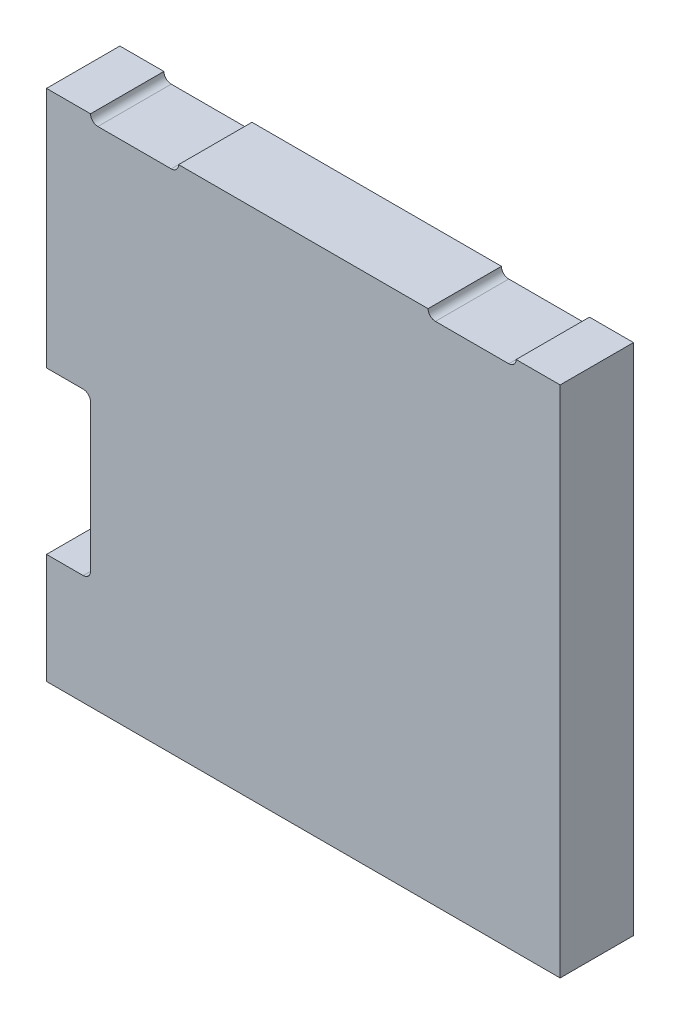
ISO-10303-21;
HEADER;
FILE_DESCRIPTION(('STEP AP214'),'2;1');
FILE_NAME('part.step','',(''),(''),'','','');
FILE_SCHEMA(('AUTOMOTIVE_DESIGN { 1 0 10303 214 1 1 1 1 }'));
ENDSEC;
DATA;
#1=APPLICATION_CONTEXT('core data for automotive mechanical design processes');
#2=APPLICATION_PROTOCOL_DEFINITION('international standard','automotive_design',2000,#1);
#3=PRODUCT_CONTEXT('',#1,'mechanical');
#4=PRODUCT('Part','Part','',(#3));
#5=PRODUCT_RELATED_PRODUCT_CATEGORY('part','',(#4));
#6=PRODUCT_DEFINITION_FORMATION('','',#4);
#7=PRODUCT_DEFINITION_CONTEXT('part definition',#1,'design');
#8=PRODUCT_DEFINITION('design','',#6,#7);
#9=PRODUCT_DEFINITION_SHAPE('','',#8);
#10=(LENGTH_UNIT() NAMED_UNIT(*) SI_UNIT(.MILLI.,.METRE.));
#11=(NAMED_UNIT(*) PLANE_ANGLE_UNIT() SI_UNIT($,.RADIAN.));
#12=(NAMED_UNIT(*) SI_UNIT($,.STERADIAN.) SOLID_ANGLE_UNIT());
#13=UNCERTAINTY_MEASURE_WITH_UNIT(LENGTH_MEASURE(1.E-05),#10,'distance_accuracy_value','');
#14=(GEOMETRIC_REPRESENTATION_CONTEXT(3) GLOBAL_UNCERTAINTY_ASSIGNED_CONTEXT((#13)) GLOBAL_UNIT_ASSIGNED_CONTEXT((#10,
#11,#12)) REPRESENTATION_CONTEXT('',''));
#15=CARTESIAN_POINT('',(0.,0.,0.));
#16=DIRECTION('',(0.,0.,1.));
#17=DIRECTION('',(1.,0.,0.));
#18=AXIS2_PLACEMENT_3D('',#15,#16,#17);
#19=CARTESIAN_POINT('',(0.,35.,10.));
#20=DIRECTION('',(0.,1.,0.));
#21=DIRECTION('',(0.,0.,1.));
#22=AXIS2_PLACEMENT_3D('',#19,#20,#21);
#23=PLANE('',#22);
#24=DIRECTION('',(1.,0.,0.));
#25=VECTOR('',#24,1.);
#26=CARTESIAN_POINT('',(0.,35.,0.));
#27=LINE('',#26,#25);
#28=CARTESIAN_POINT('',(29.,35.,0.));
#29=VERTEX_POINT('',#28);
#30=CARTESIAN_POINT('',(35.,35.,0.));
#31=VERTEX_POINT('',#30);
#32=EDGE_CURVE('E174',#29,#31,#27,.T.);
#33=ORIENTED_EDGE('',*,*,#32,.F.);
#34=DIRECTION('',(0.,0.,-1.));
#35=VECTOR('',#34,1.);
#36=CARTESIAN_POINT('',(29.,35.,10.));
#37=LINE('',#36,#35);
#38=CARTESIAN_POINT('',(29.,35.,10.));
#39=VERTEX_POINT('',#38);
#40=EDGE_CURVE('E169',#39,#29,#37,.T.);
#41=ORIENTED_EDGE('',*,*,#40,.F.);
#42=DIRECTION('',(1.,0.,0.));
#43=VECTOR('',#42,1.);
#44=CARTESIAN_POINT('',(0.,35.,10.));
#45=LINE('',#44,#43);
#46=CARTESIAN_POINT('',(35.,35.,10.));
#47=VERTEX_POINT('',#46);
#48=EDGE_CURVE('E171',#39,#47,#45,.T.);
#49=ORIENTED_EDGE('',*,*,#48,.T.);
#50=DIRECTION('',(0.,0.,-1.));
#51=VECTOR('',#50,1.);
#52=CARTESIAN_POINT('',(35.,35.,10.));
#53=LINE('',#52,#51);
#54=EDGE_CURVE('E331',#47,#31,#53,.T.);
#55=ORIENTED_EDGE('',*,*,#54,.T.);
#56=EDGE_LOOP('',(#33,#41,#49,#55));
#57=FACE_BOUND('',#56,.T.);
#58=ADVANCED_FACE('F41',(#57),#23,.T.);
#59=CARTESIAN_POINT('',(0.,34.,10.));
#60=DIRECTION('',(0.,1.,0.));
#61=DIRECTION('',(0.,0.,1.));
#62=AXIS2_PLACEMENT_3D('',#59,#60,#61);
#63=PLANE('',#62);
#64=DIRECTION('',(1.,0.,0.));
#65=VECTOR('',#64,1.);
#66=CARTESIAN_POINT('',(0.,34.,10.));
#67=LINE('',#66,#65);
#68=CARTESIAN_POINT('',(18.,34.,10.));
#69=VERTEX_POINT('',#68);
#70=CARTESIAN_POINT('',(28.,34.,10.));
#71=VERTEX_POINT('',#70);
#72=EDGE_CURVE('E188',#69,#71,#67,.T.);
#73=ORIENTED_EDGE('',*,*,#72,.T.);
#74=DIRECTION('',(0.,0.,-1.));
#75=VECTOR('',#74,1.);
#76=CARTESIAN_POINT('',(28.,34.,10.));
#77=LINE('',#76,#75);
#78=CARTESIAN_POINT('',(28.,34.,0.));
#79=VERTEX_POINT('',#78);
#80=EDGE_CURVE('E196',#71,#79,#77,.T.);
#81=ORIENTED_EDGE('',*,*,#80,.T.);
#82=DIRECTION('',(1.,0.,0.));
#83=VECTOR('',#82,1.);
#84=CARTESIAN_POINT('',(0.,34.,0.));
#85=LINE('',#84,#83);
#86=CARTESIAN_POINT('',(18.,34.,0.));
#87=VERTEX_POINT('',#86);
#88=EDGE_CURVE('E292',#87,#79,#85,.T.);
#89=ORIENTED_EDGE('',*,*,#88,.F.);
#90=DIRECTION('',(0.,0.,-1.));
#91=VECTOR('',#90,1.);
#92=CARTESIAN_POINT('',(18.,34.,10.));
#93=LINE('',#92,#91);
#94=EDGE_CURVE('E241',#87,#69,#93,.F.);
#95=ORIENTED_EDGE('',*,*,#94,.T.);
#96=EDGE_LOOP('',(#73,#81,#89,#95));
#97=FACE_BOUND('',#96,.T.);
#98=ADVANCED_FACE('F290',(#97),#63,.T.);
#99=CARTESIAN_POINT('',(-17.,35.,0.));
#100=VERTEX_POINT('',#99);
#101=CARTESIAN_POINT('',(17.,35.,0.));
#102=VERTEX_POINT('',#101);
#103=EDGE_CURVE('E232',#100,#102,#27,.T.);
#104=ORIENTED_EDGE('',*,*,#103,.F.);
#105=DIRECTION('',(0.,0.,-1.));
#106=VECTOR('',#105,1.);
#107=CARTESIAN_POINT('',(-17.,35.,10.));
#108=LINE('',#107,#106);
#109=CARTESIAN_POINT('',(-17.,35.,10.));
#110=VERTEX_POINT('',#109);
#111=EDGE_CURVE('E305',#110,#100,#108,.T.);
#112=ORIENTED_EDGE('',*,*,#111,.F.);
#113=CARTESIAN_POINT('',(17.,35.,10.));
#114=VERTEX_POINT('',#113);
#115=EDGE_CURVE('E192',#110,#114,#45,.T.);
#116=ORIENTED_EDGE('',*,*,#115,.T.);
#117=DIRECTION('',(0.,0.,-1.));
#118=VECTOR('',#117,1.);
#119=CARTESIAN_POINT('',(17.,35.,10.));
#120=LINE('',#119,#118);
#121=EDGE_CURVE('E179',#114,#102,#120,.T.);
#122=ORIENTED_EDGE('',*,*,#121,.T.);
#123=EDGE_LOOP('',(#104,#112,#116,#122));
#124=FACE_BOUND('',#123,.T.);
#125=ADVANCED_FACE('F379',(#124),#23,.T.);
#126=CARTESIAN_POINT('',(0.,34.,10.));
#127=DIRECTION('',(0.,1.,0.));
#128=DIRECTION('',(0.,0.,1.));
#129=AXIS2_PLACEMENT_3D('',#126,#127,#128);
#130=PLANE('',#129);
#131=DIRECTION('',(1.,0.,0.));
#132=VECTOR('',#131,1.);
#133=CARTESIAN_POINT('',(0.,34.,10.));
#134=LINE('',#133,#132);
#135=CARTESIAN_POINT('',(-28.,34.,10.));
#136=VERTEX_POINT('',#135);
#137=CARTESIAN_POINT('',(-18.,34.,10.));
#138=VERTEX_POINT('',#137);
#139=EDGE_CURVE('E374',#136,#138,#134,.T.);
#140=ORIENTED_EDGE('',*,*,#139,.T.);
#141=DIRECTION('',(0.,0.,-1.));
#142=VECTOR('',#141,1.);
#143=CARTESIAN_POINT('',(-18.,34.,10.));
#144=LINE('',#143,#142);
#145=CARTESIAN_POINT('',(-18.,34.,0.));
#146=VERTEX_POINT('',#145);
#147=EDGE_CURVE('E230',#138,#146,#144,.T.);
#148=ORIENTED_EDGE('',*,*,#147,.T.);
#149=DIRECTION('',(1.,0.,0.));
#150=VECTOR('',#149,1.);
#151=CARTESIAN_POINT('',(0.,34.,0.));
#152=LINE('',#151,#150);
#153=CARTESIAN_POINT('',(-28.,34.,0.));
#154=VERTEX_POINT('',#153);
#155=EDGE_CURVE('E220',#154,#146,#152,.T.);
#156=ORIENTED_EDGE('',*,*,#155,.F.);
#157=DIRECTION('',(0.,0.,-1.));
#158=VECTOR('',#157,1.);
#159=CARTESIAN_POINT('',(-28.,34.,10.));
#160=LINE('',#159,#158);
#161=EDGE_CURVE('E64',#154,#136,#160,.F.);
#162=ORIENTED_EDGE('',*,*,#161,.T.);
#163=EDGE_LOOP('',(#140,#148,#156,#162));
#164=FACE_BOUND('',#163,.T.);
#165=ADVANCED_FACE('F228',(#164),#130,.T.);
#166=CARTESIAN_POINT('',(-35.,35.,0.));
#167=VERTEX_POINT('',#166);
#168=CARTESIAN_POINT('',(-29.,35.,0.));
#169=VERTEX_POINT('',#168);
#170=EDGE_CURVE('E223',#167,#169,#27,.T.);
#171=ORIENTED_EDGE('',*,*,#170,.F.);
#172=DIRECTION('',(0.,0.,-1.));
#173=VECTOR('',#172,1.);
#174=CARTESIAN_POINT('',(-35.,35.,10.));
#175=LINE('',#174,#173);
#176=CARTESIAN_POINT('',(-35.,35.,10.));
#177=VERTEX_POINT('',#176);
#178=EDGE_CURVE('E314',#177,#167,#175,.T.);
#179=ORIENTED_EDGE('',*,*,#178,.F.);
#180=CARTESIAN_POINT('',(-29.,35.,10.));
#181=VERTEX_POINT('',#180);
#182=EDGE_CURVE('E191',#177,#181,#45,.T.);
#183=ORIENTED_EDGE('',*,*,#182,.T.);
#184=DIRECTION('',(0.,0.,-1.));
#185=VECTOR('',#184,1.);
#186=CARTESIAN_POINT('',(-29.,35.,10.));
#187=LINE('',#186,#185);
#188=EDGE_CURVE('E309',#181,#169,#187,.T.);
#189=ORIENTED_EDGE('',*,*,#188,.T.);
#190=EDGE_LOOP('',(#171,#179,#183,#189));
#191=FACE_BOUND('',#190,.T.);
#192=ADVANCED_FACE('F410',(#191),#23,.T.);
#193=CARTESIAN_POINT('',(-35.,0.,10.));
#194=DIRECTION('',(1.,0.,0.));
#195=DIRECTION('',(0.,0.,-1.));
#196=AXIS2_PLACEMENT_3D('',#193,#194,#195);
#197=PLANE('',#196);
#198=DIRECTION('',(0.,-1.,0.));
#199=VECTOR('',#198,1.);
#200=CARTESIAN_POINT('',(-35.,0.,0.));
#201=LINE('',#200,#199);
#202=CARTESIAN_POINT('',(-35.,1.99999999999999,0.));
#203=VERTEX_POINT('',#202);
#204=EDGE_CURVE('E353',#167,#203,#201,.T.);
#205=ORIENTED_EDGE('',*,*,#204,.T.);
#206=DIRECTION('',(0.,0.,-1.));
#207=VECTOR('',#206,1.);
#208=CARTESIAN_POINT('',(-35.,1.99999999999999,10.));
#209=LINE('',#208,#207);
#210=CARTESIAN_POINT('',(-35.,1.99999999999999,10.));
#211=VERTEX_POINT('',#210);
#212=EDGE_CURVE('E317',#211,#203,#209,.T.);
#213=ORIENTED_EDGE('',*,*,#212,.F.);
#214=DIRECTION('',(0.,-1.,0.));
#215=VECTOR('',#214,1.);
#216=CARTESIAN_POINT('',(-35.,0.,10.));
#217=LINE('',#216,#215);
#218=EDGE_CURVE('E371',#177,#211,#217,.T.);
#219=ORIENTED_EDGE('',*,*,#218,.F.);
#220=ORIENTED_EDGE('',*,*,#178,.T.);
#221=EDGE_LOOP('',(#205,#213,#219,#220));
#222=FACE_BOUND('',#221,.T.);
#223=ADVANCED_FACE('F419',(#222),#197,.F.);
#224=CARTESIAN_POINT('',(0.,1.99999999999999,10.));
#225=DIRECTION('',(0.,1.,0.));
#226=DIRECTION('',(0.,0.,1.));
#227=AXIS2_PLACEMENT_3D('',#224,#225,#226);
#228=PLANE('',#227);
#229=DIRECTION('',(1.,0.,0.));
#230=VECTOR('',#229,1.);
#231=CARTESIAN_POINT('',(0.,1.99999999999999,0.));
#232=LINE('',#231,#230);
#233=CARTESIAN_POINT('',(-30.,1.99999999999999,0.));
#234=VERTEX_POINT('',#233);
#235=EDGE_CURVE('E349',#203,#234,#232,.T.);
#236=ORIENTED_EDGE('',*,*,#235,.T.);
#237=DIRECTION('',(0.,0.,-1.));
#238=VECTOR('',#237,1.);
#239=CARTESIAN_POINT('',(-30.,1.99999999999999,10.));
#240=LINE('',#239,#238);
#241=CARTESIAN_POINT('',(-30.,1.99999999999999,10.));
#242=VERTEX_POINT('',#241);
#243=EDGE_CURVE('E280',#234,#242,#240,.F.);
#244=ORIENTED_EDGE('',*,*,#243,.T.);
#245=DIRECTION('',(1.,0.,0.));
#246=VECTOR('',#245,1.);
#247=CARTESIAN_POINT('',(0.,1.99999999999999,10.));
#248=LINE('',#247,#246);
#249=EDGE_CURVE('E260',#211,#242,#248,.T.);
#250=ORIENTED_EDGE('',*,*,#249,.F.);
#251=ORIENTED_EDGE('',*,*,#212,.T.);
#252=EDGE_LOOP('',(#236,#244,#250,#251));
#253=FACE_BOUND('',#252,.T.);
#254=ADVANCED_FACE('F425',(#253),#228,.F.);
#255=CARTESIAN_POINT('',(-29.,0.,10.));
#256=DIRECTION('',(1.,0.,0.));
#257=DIRECTION('',(0.,0.,-1.));
#258=AXIS2_PLACEMENT_3D('',#255,#256,#257);
#259=PLANE('',#258);
#260=DIRECTION('',(0.,-1.,0.));
#261=VECTOR('',#260,1.);
#262=CARTESIAN_POINT('',(-29.,0.,0.));
#263=LINE('',#262,#261);
#264=CARTESIAN_POINT('',(-29.,0.999999999999995,0.));
#265=VERTEX_POINT('',#264);
#266=CARTESIAN_POINT('',(-29.,-19.,0.));
#267=VERTEX_POINT('',#266);
#268=EDGE_CURVE('E346',#265,#267,#263,.T.);
#269=ORIENTED_EDGE('',*,*,#268,.T.);
#270=DIRECTION('',(0.,0.,-1.));
#271=VECTOR('',#270,1.);
#272=CARTESIAN_POINT('',(-29.,-19.,10.));
#273=LINE('',#272,#271);
#274=CARTESIAN_POINT('',(-29.,-19.,10.));
#275=VERTEX_POINT('',#274);
#276=EDGE_CURVE('E271',#267,#275,#273,.F.);
#277=ORIENTED_EDGE('',*,*,#276,.T.);
#278=DIRECTION('',(0.,-1.,0.));
#279=VECTOR('',#278,1.);
#280=CARTESIAN_POINT('',(-29.,0.,10.));
#281=LINE('',#280,#279);
#282=CARTESIAN_POINT('',(-29.,0.999999999999995,10.));
#283=VERTEX_POINT('',#282);
#284=EDGE_CURVE('E257',#283,#275,#281,.T.);
#285=ORIENTED_EDGE('',*,*,#284,.F.);
#286=DIRECTION('',(0.,0.,-1.));
#287=VECTOR('',#286,1.);
#288=CARTESIAN_POINT('',(-29.,0.999999999999995,0.));
#289=LINE('',#288,#287);
#290=EDGE_CURVE('E268',#283,#265,#289,.T.);
#291=ORIENTED_EDGE('',*,*,#290,.T.);
#292=EDGE_LOOP('',(#269,#277,#285,#291));
#293=FACE_BOUND('',#292,.T.);
#294=ADVANCED_FACE('F267',(#293),#259,.F.);
#295=CARTESIAN_POINT('',(0.,-20.,10.));
#296=DIRECTION('',(0.,1.,0.));
#297=DIRECTION('',(0.,0.,1.));
#298=AXIS2_PLACEMENT_3D('',#295,#296,#297);
#299=PLANE('',#298);
#300=DIRECTION('',(1.,0.,0.));
#301=VECTOR('',#300,1.);
#302=CARTESIAN_POINT('',(0.,-20.,10.));
#303=LINE('',#302,#301);
#304=CARTESIAN_POINT('',(-35.,-20.,10.));
#305=VERTEX_POINT('',#304);
#306=CARTESIAN_POINT('',(-30.,-20.,10.));
#307=VERTEX_POINT('',#306);
#308=EDGE_CURVE('E273',#305,#307,#303,.T.);
#309=ORIENTED_EDGE('',*,*,#308,.T.);
#310=DIRECTION('',(0.,0.,-1.));
#311=VECTOR('',#310,1.);
#312=CARTESIAN_POINT('',(-30.,-20.,10.));
#313=LINE('',#312,#311);
#314=CARTESIAN_POINT('',(-30.,-20.,0.));
#315=VERTEX_POINT('',#314);
#316=EDGE_CURVE('E178',#307,#315,#313,.T.);
#317=ORIENTED_EDGE('',*,*,#316,.T.);
#318=DIRECTION('',(1.,0.,0.));
#319=VECTOR('',#318,1.);
#320=CARTESIAN_POINT('',(0.,-20.,0.));
#321=LINE('',#320,#319);
#322=CARTESIAN_POINT('',(-35.,-20.,0.));
#323=VERTEX_POINT('',#322);
#324=EDGE_CURVE('E342',#323,#315,#321,.T.);
#325=ORIENTED_EDGE('',*,*,#324,.F.);
#326=DIRECTION('',(0.,0.,-1.));
#327=VECTOR('',#326,1.);
#328=CARTESIAN_POINT('',(-35.,-20.,10.));
#329=LINE('',#328,#327);
#330=EDGE_CURVE('E321',#305,#323,#329,.T.);
#331=ORIENTED_EDGE('',*,*,#330,.F.);
#332=EDGE_LOOP('',(#309,#317,#325,#331));
#333=FACE_BOUND('',#332,.T.);
#334=ADVANCED_FACE('F438',(#333),#299,.T.);
#335=CARTESIAN_POINT('',(-35.,-35.,0.));
#336=VERTEX_POINT('',#335);
#337=EDGE_CURVE('E341',#323,#336,#201,.T.);
#338=ORIENTED_EDGE('',*,*,#337,.T.);
#339=DIRECTION('',(0.,0.,-1.));
#340=VECTOR('',#339,1.);
#341=CARTESIAN_POINT('',(-35.,-35.,10.));
#342=LINE('',#341,#340);
#343=CARTESIAN_POINT('',(-35.,-35.,10.));
#344=VERTEX_POINT('',#343);
#345=EDGE_CURVE('E324',#344,#336,#342,.T.);
#346=ORIENTED_EDGE('',*,*,#345,.F.);
#347=EDGE_CURVE('E365',#305,#344,#217,.T.);
#348=ORIENTED_EDGE('',*,*,#347,.F.);
#349=ORIENTED_EDGE('',*,*,#330,.T.);
#350=EDGE_LOOP('',(#338,#346,#348,#349));
#351=FACE_BOUND('',#350,.T.);
#352=ADVANCED_FACE('F388',(#351),#197,.F.);
#353=CARTESIAN_POINT('',(0.,-35.,10.));
#354=DIRECTION('',(0.,1.,0.));
#355=DIRECTION('',(0.,0.,1.));
#356=AXIS2_PLACEMENT_3D('',#353,#354,#355);
#357=PLANE('',#356);
#358=DIRECTION('',(1.,0.,0.));
#359=VECTOR('',#358,1.);
#360=CARTESIAN_POINT('',(0.,-35.,0.));
#361=LINE('',#360,#359);
#362=CARTESIAN_POINT('',(35.,-35.,0.));
#363=VERTEX_POINT('',#362);
#364=EDGE_CURVE('E337',#336,#363,#361,.T.);
#365=ORIENTED_EDGE('',*,*,#364,.T.);
#366=DIRECTION('',(0.,0.,-1.));
#367=VECTOR('',#366,1.);
#368=CARTESIAN_POINT('',(35.,-35.,10.));
#369=LINE('',#368,#367);
#370=CARTESIAN_POINT('',(35.,-35.,10.));
#371=VERTEX_POINT('',#370);
#372=EDGE_CURVE('E328',#371,#363,#369,.T.);
#373=ORIENTED_EDGE('',*,*,#372,.F.);
#374=DIRECTION('',(1.,0.,0.));
#375=VECTOR('',#374,1.);
#376=CARTESIAN_POINT('',(0.,-35.,10.));
#377=LINE('',#376,#375);
#378=EDGE_CURVE('E362',#344,#371,#377,.T.);
#379=ORIENTED_EDGE('',*,*,#378,.F.);
#380=ORIENTED_EDGE('',*,*,#345,.T.);
#381=EDGE_LOOP('',(#365,#373,#379,#380));
#382=FACE_BOUND('',#381,.T.);
#383=ADVANCED_FACE('F394',(#382),#357,.F.);
#384=CARTESIAN_POINT('',(35.,0.,10.));
#385=DIRECTION('',(1.,0.,0.));
#386=DIRECTION('',(0.,1.,0.));
#387=AXIS2_PLACEMENT_3D('',#384,#385,#386);
#388=PLANE('',#387);
#389=DIRECTION('',(0.,-1.,0.));
#390=VECTOR('',#389,1.);
#391=CARTESIAN_POINT('',(35.,0.,0.));
#392=LINE('',#391,#390);
#393=EDGE_CURVE('E189',#31,#363,#392,.T.);
#394=ORIENTED_EDGE('',*,*,#393,.F.);
#395=ORIENTED_EDGE('',*,*,#54,.F.);
#396=DIRECTION('',(0.,-1.,0.));
#397=VECTOR('',#396,1.);
#398=CARTESIAN_POINT('',(35.,0.,10.));
#399=LINE('',#398,#397);
#400=EDGE_CURVE('E186',#47,#371,#399,.T.);
#401=ORIENTED_EDGE('',*,*,#400,.T.);
#402=ORIENTED_EDGE('',*,*,#372,.T.);
#403=EDGE_LOOP('',(#394,#395,#401,#402));
#404=FACE_BOUND('',#403,.T.);
#405=ADVANCED_FACE('F398',(#404),#388,.T.);
#406=CARTESIAN_POINT('',(0.,0.,10.));
#407=DIRECTION('',(0.,0.,1.));
#408=DIRECTION('',(1.,0.,0.));
#409=AXIS2_PLACEMENT_3D('',#406,#407,#408);
#410=PLANE('',#409);
#411=ORIENTED_EDGE('',*,*,#48,.F.);
#412=CARTESIAN_POINT('',(28.,35.,10.));
#413=DIRECTION('',(0.,0.,1.));
#414=DIRECTION('',(1.,0.,0.));
#415=AXIS2_PLACEMENT_3D('',#412,#413,#414);
#416=CIRCLE('',#415,1.);
#417=EDGE_CURVE('E183',#39,#71,#416,.F.);
#418=ORIENTED_EDGE('',*,*,#417,.T.);
#419=ORIENTED_EDGE('',*,*,#72,.F.);
#420=CARTESIAN_POINT('',(18.,35.,10.));
#421=DIRECTION('',(0.,0.,1.));
#422=DIRECTION('',(1.,0.,0.));
#423=AXIS2_PLACEMENT_3D('',#420,#421,#422);
#424=CIRCLE('',#423,1.);
#425=EDGE_CURVE('E203',#69,#114,#424,.F.);
#426=ORIENTED_EDGE('',*,*,#425,.T.);
#427=ORIENTED_EDGE('',*,*,#115,.F.);
#428=CARTESIAN_POINT('',(-18.,35.,10.));
#429=DIRECTION('',(0.,0.,1.));
#430=DIRECTION('',(1.,0.,0.));
#431=AXIS2_PLACEMENT_3D('',#428,#429,#430);
#432=CIRCLE('',#431,1.);
#433=EDGE_CURVE('E57',#110,#138,#432,.F.);
#434=ORIENTED_EDGE('',*,*,#433,.T.);
#435=ORIENTED_EDGE('',*,*,#139,.F.);
#436=CARTESIAN_POINT('',(-28.,35.,10.));
#437=DIRECTION('',(0.,0.,1.));
#438=DIRECTION('',(1.,0.,0.));
#439=AXIS2_PLACEMENT_3D('',#436,#437,#438);
#440=CIRCLE('',#439,1.);
#441=EDGE_CURVE('E11',#136,#181,#440,.F.);
#442=ORIENTED_EDGE('',*,*,#441,.T.);
#443=ORIENTED_EDGE('',*,*,#182,.F.);
#444=ORIENTED_EDGE('',*,*,#218,.T.);
#445=ORIENTED_EDGE('',*,*,#249,.T.);
#446=CARTESIAN_POINT('',(-30.,0.999999999999995,10.));
#447=DIRECTION('',(0.,0.,1.));
#448=DIRECTION('',(1.,0.,0.));
#449=AXIS2_PLACEMENT_3D('',#446,#447,#448);
#450=CIRCLE('',#449,1.);
#451=EDGE_CURVE('E205',#242,#283,#450,.F.);
#452=ORIENTED_EDGE('',*,*,#451,.T.);
#453=ORIENTED_EDGE('',*,*,#284,.T.);
#454=CARTESIAN_POINT('',(-30.,-19.,10.));
#455=DIRECTION('',(0.,0.,1.));
#456=DIRECTION('',(1.,0.,0.));
#457=AXIS2_PLACEMENT_3D('',#454,#455,#456);
#458=CIRCLE('',#457,1.);
#459=EDGE_CURVE('E247',#275,#307,#458,.F.);
#460=ORIENTED_EDGE('',*,*,#459,.T.);
#461=ORIENTED_EDGE('',*,*,#308,.F.);
#462=ORIENTED_EDGE('',*,*,#347,.T.);
#463=ORIENTED_EDGE('',*,*,#378,.T.);
#464=ORIENTED_EDGE('',*,*,#400,.F.);
#465=EDGE_LOOP('',(#411,#418,#419,#426,#427,#434,#435,#442,#443,#444,#445,#452,#453,#460,#461,
#462,#463,#464));
#466=FACE_BOUND('',#465,.T.);
#467=ADVANCED_FACE('F181',(#466),#410,.T.);
#468=CARTESIAN_POINT('',(0.,0.,0.));
#469=DIRECTION('',(0.,0.,1.));
#470=DIRECTION('',(1.,0.,0.));
#471=AXIS2_PLACEMENT_3D('',#468,#469,#470);
#472=PLANE('',#471);
#473=ORIENTED_EDGE('',*,*,#32,.T.);
#474=ORIENTED_EDGE('',*,*,#393,.T.);
#475=ORIENTED_EDGE('',*,*,#364,.F.);
#476=ORIENTED_EDGE('',*,*,#337,.F.);
#477=ORIENTED_EDGE('',*,*,#324,.T.);
#478=CARTESIAN_POINT('',(-30.,-19.,0.));
#479=DIRECTION('',(0.,0.,1.));
#480=DIRECTION('',(1.,0.,0.));
#481=AXIS2_PLACEMENT_3D('',#478,#479,#480);
#482=CIRCLE('',#481,1.);
#483=EDGE_CURVE('E239',#315,#267,#482,.T.);
#484=ORIENTED_EDGE('',*,*,#483,.T.);
#485=ORIENTED_EDGE('',*,*,#268,.F.);
#486=CARTESIAN_POINT('',(-30.,0.999999999999995,0.));
#487=DIRECTION('',(0.,0.,1.));
#488=DIRECTION('',(1.,0.,0.));
#489=AXIS2_PLACEMENT_3D('',#486,#487,#488);
#490=CIRCLE('',#489,1.);
#491=EDGE_CURVE('E250',#265,#234,#490,.T.);
#492=ORIENTED_EDGE('',*,*,#491,.T.);
#493=ORIENTED_EDGE('',*,*,#235,.F.);
#494=ORIENTED_EDGE('',*,*,#204,.F.);
#495=ORIENTED_EDGE('',*,*,#170,.T.);
#496=CARTESIAN_POINT('',(-28.,35.,0.));
#497=DIRECTION('',(0.,0.,1.));
#498=DIRECTION('',(1.,0.,0.));
#499=AXIS2_PLACEMENT_3D('',#496,#497,#498);
#500=CIRCLE('',#499,1.);
#501=EDGE_CURVE('E50',#169,#154,#500,.T.);
#502=ORIENTED_EDGE('',*,*,#501,.T.);
#503=ORIENTED_EDGE('',*,*,#155,.T.);
#504=CARTESIAN_POINT('',(-18.,35.,0.));
#505=DIRECTION('',(0.,0.,1.));
#506=DIRECTION('',(1.,0.,0.));
#507=AXIS2_PLACEMENT_3D('',#504,#505,#506);
#508=CIRCLE('',#507,1.);
#509=EDGE_CURVE('E211',#146,#100,#508,.T.);
#510=ORIENTED_EDGE('',*,*,#509,.T.);
#511=ORIENTED_EDGE('',*,*,#103,.T.);
#512=CARTESIAN_POINT('',(18.,35.,0.));
#513=DIRECTION('',(0.,0.,1.));
#514=DIRECTION('',(1.,0.,0.));
#515=AXIS2_PLACEMENT_3D('',#512,#513,#514);
#516=CIRCLE('',#515,1.);
#517=EDGE_CURVE('E198',#102,#87,#516,.T.);
#518=ORIENTED_EDGE('',*,*,#517,.T.);
#519=ORIENTED_EDGE('',*,*,#88,.T.);
#520=CARTESIAN_POINT('',(28.,35.,0.));
#521=DIRECTION('',(0.,0.,1.));
#522=DIRECTION('',(1.,0.,0.));
#523=AXIS2_PLACEMENT_3D('',#520,#521,#522);
#524=CIRCLE('',#523,1.);
#525=EDGE_CURVE('E199',#79,#29,#524,.T.);
#526=ORIENTED_EDGE('',*,*,#525,.T.);
#527=EDGE_LOOP('',(#473,#474,#475,#476,#477,#484,#485,#492,#493,#494,#495,#502,#503,#510,#511,
#518,#519,#526));
#528=FACE_BOUND('',#527,.T.);
#529=ADVANCED_FACE('F219',(#528),#472,.F.);
#530=CARTESIAN_POINT('',(-30.,-19.,10.));
#531=DIRECTION('',(0.,0.,-1.));
#532=DIRECTION('',(-1.,0.,0.));
#533=AXIS2_PLACEMENT_3D('',#530,#531,#532);
#534=CYLINDRICAL_SURFACE('',#533,1.);
#535=ORIENTED_EDGE('',*,*,#459,.F.);
#536=ORIENTED_EDGE('',*,*,#276,.F.);
#537=ORIENTED_EDGE('',*,*,#483,.F.);
#538=ORIENTED_EDGE('',*,*,#316,.F.);
#539=EDGE_LOOP('',(#535,#536,#537,#538));
#540=FACE_BOUND('',#539,.T.);
#541=ADVANCED_FACE('F434',(#540),#534,.F.);
#542=CARTESIAN_POINT('',(-30.,0.999999999999995,10.));
#543=DIRECTION('',(0.,0.,1.));
#544=DIRECTION('',(1.,0.,0.));
#545=AXIS2_PLACEMENT_3D('',#542,#543,#544);
#546=CYLINDRICAL_SURFACE('',#545,1.);
#547=ORIENTED_EDGE('',*,*,#451,.F.);
#548=ORIENTED_EDGE('',*,*,#243,.F.);
#549=ORIENTED_EDGE('',*,*,#491,.F.);
#550=ORIENTED_EDGE('',*,*,#290,.F.);
#551=EDGE_LOOP('',(#547,#548,#549,#550));
#552=FACE_BOUND('',#551,.T.);
#553=ADVANCED_FACE('F275',(#552),#546,.F.);
#554=CARTESIAN_POINT('',(28.,35.,10.));
#555=DIRECTION('',(0.,0.,-1.));
#556=DIRECTION('',(-1.,0.,0.));
#557=AXIS2_PLACEMENT_3D('',#554,#555,#556);
#558=CYLINDRICAL_SURFACE('',#557,1.);
#559=ORIENTED_EDGE('',*,*,#417,.F.);
#560=ORIENTED_EDGE('',*,*,#40,.T.);
#561=ORIENTED_EDGE('',*,*,#525,.F.);
#562=ORIENTED_EDGE('',*,*,#80,.F.);
#563=EDGE_LOOP('',(#559,#560,#561,#562));
#564=FACE_BOUND('',#563,.T.);
#565=ADVANCED_FACE('F194',(#564),#558,.F.);
#566=CARTESIAN_POINT('',(18.,35.,10.));
#567=DIRECTION('',(0.,0.,1.));
#568=DIRECTION('',(1.,0.,0.));
#569=AXIS2_PLACEMENT_3D('',#566,#567,#568);
#570=CYLINDRICAL_SURFACE('',#569,1.);
#571=ORIENTED_EDGE('',*,*,#425,.F.);
#572=ORIENTED_EDGE('',*,*,#94,.F.);
#573=ORIENTED_EDGE('',*,*,#517,.F.);
#574=ORIENTED_EDGE('',*,*,#121,.F.);
#575=EDGE_LOOP('',(#571,#572,#573,#574));
#576=FACE_BOUND('',#575,.T.);
#577=ADVANCED_FACE('F299',(#576),#570,.F.);
#578=CARTESIAN_POINT('',(-18.,35.,10.));
#579=DIRECTION('',(0.,0.,-1.));
#580=DIRECTION('',(-1.,0.,0.));
#581=AXIS2_PLACEMENT_3D('',#578,#579,#580);
#582=CYLINDRICAL_SURFACE('',#581,1.);
#583=ORIENTED_EDGE('',*,*,#433,.F.);
#584=ORIENTED_EDGE('',*,*,#111,.T.);
#585=ORIENTED_EDGE('',*,*,#509,.F.);
#586=ORIENTED_EDGE('',*,*,#147,.F.);
#587=EDGE_LOOP('',(#583,#584,#585,#586));
#588=FACE_BOUND('',#587,.T.);
#589=ADVANCED_FACE('F381',(#588),#582,.F.);
#590=CARTESIAN_POINT('',(-28.,35.,10.));
#591=DIRECTION('',(0.,0.,1.));
#592=DIRECTION('',(1.,0.,0.));
#593=AXIS2_PLACEMENT_3D('',#590,#591,#592);
#594=CYLINDRICAL_SURFACE('',#593,1.);
#595=ORIENTED_EDGE('',*,*,#441,.F.);
#596=ORIENTED_EDGE('',*,*,#161,.F.);
#597=ORIENTED_EDGE('',*,*,#501,.F.);
#598=ORIENTED_EDGE('',*,*,#188,.F.);
#599=EDGE_LOOP('',(#595,#596,#597,#598));
#600=FACE_BOUND('',#599,.T.);
#601=ADVANCED_FACE('F43',(#600),#594,.F.);
#602=CLOSED_SHELL('',(#58,#98,#125,#165,#192,#223,#254,#294,#334,#352,#383,#405,#467,#529,#541,
#553,#565,#577,#589,#601));
#603=MANIFOLD_SOLID_BREP('B2',#602);
#604=ADVANCED_BREP_SHAPE_REPRESENTATION('',(#18,#603),#14);
#605=SHAPE_DEFINITION_REPRESENTATION(#9,#604);
ENDSEC;
END-ISO-10303-21;
